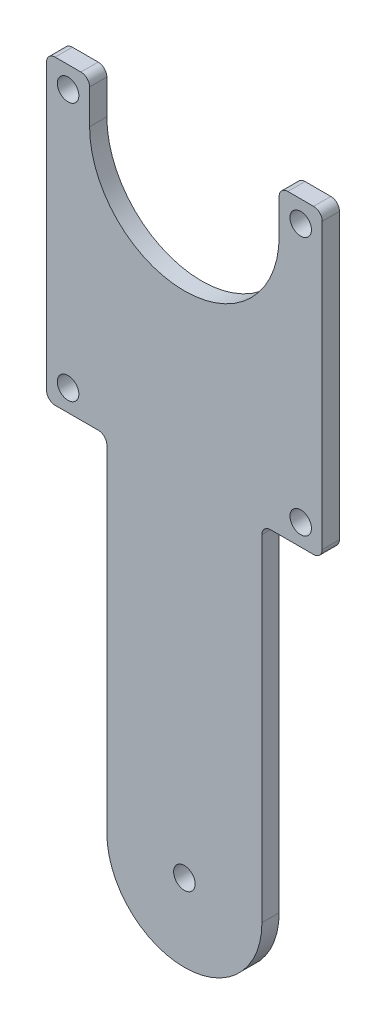
ISO-10303-21;
HEADER;
FILE_DESCRIPTION(('STEP AP214'),'2;1');
FILE_NAME('part.step','',(''),(''),'','','');
FILE_SCHEMA(('AUTOMOTIVE_DESIGN { 1 0 10303 214 1 1 1 1 }'));
ENDSEC;
DATA;
#1=APPLICATION_CONTEXT('core data for automotive mechanical design processes');
#2=APPLICATION_PROTOCOL_DEFINITION('international standard','automotive_design',2000,#1);
#3=PRODUCT_CONTEXT('',#1,'mechanical');
#4=PRODUCT('Part','Part','',(#3));
#5=PRODUCT_RELATED_PRODUCT_CATEGORY('part','',(#4));
#6=PRODUCT_DEFINITION_FORMATION('','',#4);
#7=PRODUCT_DEFINITION_CONTEXT('part definition',#1,'design');
#8=PRODUCT_DEFINITION('design','',#6,#7);
#9=PRODUCT_DEFINITION_SHAPE('','',#8);
#10=(LENGTH_UNIT() NAMED_UNIT(*) SI_UNIT(.MILLI.,.METRE.));
#11=(NAMED_UNIT(*) PLANE_ANGLE_UNIT() SI_UNIT($,.RADIAN.));
#12=(NAMED_UNIT(*) SI_UNIT($,.STERADIAN.) SOLID_ANGLE_UNIT());
#13=UNCERTAINTY_MEASURE_WITH_UNIT(LENGTH_MEASURE(1.E-05),#10,'distance_accuracy_value','');
#14=(GEOMETRIC_REPRESENTATION_CONTEXT(3) GLOBAL_UNCERTAINTY_ASSIGNED_CONTEXT((#13)) GLOBAL_UNIT_ASSIGNED_CONTEXT((#10,
#11,#12)) REPRESENTATION_CONTEXT('',''));
#15=CARTESIAN_POINT('',(0.,0.,0.));
#16=DIRECTION('',(0.,0.,1.));
#17=DIRECTION('',(1.,0.,0.));
#18=AXIS2_PLACEMENT_3D('',#15,#16,#17);
#19=CARTESIAN_POINT('',(0.,14.595813748091,2.));
#20=DIRECTION('',(0.,-1.,0.));
#21=DIRECTION('',(0.,0.,-1.));
#22=AXIS2_PLACEMENT_3D('',#19,#20,#21);
#23=PLANE('',#22);
#24=DIRECTION('',(-1.,0.,0.));
#25=VECTOR('',#24,1.);
#26=CARTESIAN_POINT('',(0.,14.595813748091,0.));
#27=LINE('',#26,#25);
#28=CARTESIAN_POINT('',(23.0486139328405,14.595813748091,0.));
#29=VERTEX_POINT('',#28);
#30=CARTESIAN_POINT('',(20.0486139328405,14.595813748091,0.));
#31=VERTEX_POINT('',#30);
#32=EDGE_CURVE('E218',#29,#31,#27,.T.);
#33=ORIENTED_EDGE('',*,*,#32,.T.);
#34=DIRECTION('',(0.,0.,-1.));
#35=VECTOR('',#34,1.);
#36=CARTESIAN_POINT('',(20.0486139328405,14.595813748091,2.));
#37=LINE('',#36,#35);
#38=CARTESIAN_POINT('',(20.0486139328405,14.595813748091,2.));
#39=VERTEX_POINT('',#38);
#40=EDGE_CURVE('E11',#39,#31,#37,.T.);
#41=ORIENTED_EDGE('',*,*,#40,.F.);
#42=DIRECTION('',(-1.,0.,0.));
#43=VECTOR('',#42,1.);
#44=CARTESIAN_POINT('',(0.,14.595813748091,2.));
#45=LINE('',#44,#43);
#46=CARTESIAN_POINT('',(23.0486139328405,14.595813748091,2.));
#47=VERTEX_POINT('',#46);
#48=EDGE_CURVE('E679',#47,#39,#45,.T.);
#49=ORIENTED_EDGE('',*,*,#48,.F.);
#50=DIRECTION('',(0.,0.,-1.));
#51=VECTOR('',#50,1.);
#52=CARTESIAN_POINT('',(23.0486139328405,14.595813748091,2.));
#53=LINE('',#52,#51);
#54=EDGE_CURVE('E51',#47,#29,#53,.T.);
#55=ORIENTED_EDGE('',*,*,#54,.T.);
#56=EDGE_LOOP('',(#33,#41,#49,#55));
#57=FACE_BOUND('',#56,.T.);
#58=ADVANCED_FACE('F34',(#57),#23,.F.);
#59=CARTESIAN_POINT('',(20.0486139328405,13.595813748091,2.));
#60=DIRECTION('',(0.,0.,-1.));
#61=DIRECTION('',(-1.,0.,0.));
#62=AXIS2_PLACEMENT_3D('',#59,#60,#61);
#63=CYLINDRICAL_SURFACE('',#62,1.);
#64=CARTESIAN_POINT('',(20.0486139328405,13.595813748091,0.));
#65=DIRECTION('',(0.,0.,1.));
#66=DIRECTION('',(1.,0.,0.));
#67=AXIS2_PLACEMENT_3D('',#64,#65,#66);
#68=CIRCLE('',#67,1.);
#69=CARTESIAN_POINT('',(19.0486139328405,13.595813748091,0.));
#70=VERTEX_POINT('',#69);
#71=EDGE_CURVE('E220',#31,#70,#68,.T.);
#72=ORIENTED_EDGE('',*,*,#71,.T.);
#73=DIRECTION('',(0.,0.,-1.));
#74=VECTOR('',#73,1.);
#75=CARTESIAN_POINT('',(19.0486139328405,13.595813748091,2.));
#76=LINE('',#75,#74);
#77=CARTESIAN_POINT('',(19.0486139328405,13.595813748091,2.));
#78=VERTEX_POINT('',#77);
#79=EDGE_CURVE('E43',#78,#70,#76,.T.);
#80=ORIENTED_EDGE('',*,*,#79,.F.);
#81=CARTESIAN_POINT('',(20.0486139328405,13.595813748091,2.));
#82=DIRECTION('',(0.,0.,1.));
#83=DIRECTION('',(1.,0.,0.));
#84=AXIS2_PLACEMENT_3D('',#81,#82,#83);
#85=CIRCLE('',#84,1.);
#86=EDGE_CURVE('E125',#39,#78,#85,.T.);
#87=ORIENTED_EDGE('',*,*,#86,.F.);
#88=ORIENTED_EDGE('',*,*,#40,.T.);
#89=EDGE_LOOP('',(#72,#80,#87,#88));
#90=FACE_BOUND('',#89,.T.);
#91=ADVANCED_FACE('F374',(#90),#63,.T.);
#92=CARTESIAN_POINT('',(19.0486139328405,0.,2.));
#93=DIRECTION('',(1.,0.,0.));
#94=DIRECTION('',(0.,0.,-1.));
#95=AXIS2_PLACEMENT_3D('',#92,#93,#94);
#96=PLANE('',#95);
#97=DIRECTION('',(0.,-1.,0.));
#98=VECTOR('',#97,1.);
#99=CARTESIAN_POINT('',(19.0486139328405,0.,0.));
#100=LINE('',#99,#98);
#101=CARTESIAN_POINT('',(19.0486139328405,9.59581374809096,0.));
#102=VERTEX_POINT('',#101);
#103=EDGE_CURVE('E222',#70,#102,#100,.T.);
#104=ORIENTED_EDGE('',*,*,#103,.T.);
#105=DIRECTION('',(0.,0.,-1.));
#106=VECTOR('',#105,1.);
#107=CARTESIAN_POINT('',(19.0486139328405,9.59581374809096,2.));
#108=LINE('',#107,#106);
#109=CARTESIAN_POINT('',(19.0486139328405,9.59581374809096,2.));
#110=VERTEX_POINT('',#109);
#111=EDGE_CURVE('E303',#110,#102,#108,.T.);
#112=ORIENTED_EDGE('',*,*,#111,.F.);
#113=DIRECTION('',(0.,-1.,0.));
#114=VECTOR('',#113,1.);
#115=CARTESIAN_POINT('',(19.0486139328405,0.,2.));
#116=LINE('',#115,#114);
#117=EDGE_CURVE('E310',#78,#110,#116,.T.);
#118=ORIENTED_EDGE('',*,*,#117,.F.);
#119=ORIENTED_EDGE('',*,*,#79,.T.);
#120=EDGE_LOOP('',(#104,#112,#118,#119));
#121=FACE_BOUND('',#120,.T.);
#122=ADVANCED_FACE('F308',(#121),#96,.F.);
#123=CARTESIAN_POINT('',(8.0486139328405,9.59581374809096,2.));
#124=DIRECTION('',(0.,0.,-1.));
#125=DIRECTION('',(-1.,0.,0.));
#126=AXIS2_PLACEMENT_3D('',#123,#124,#125);
#127=CYLINDRICAL_SURFACE('',#126,11.);
#128=CARTESIAN_POINT('',(8.0486139328405,9.59581374809096,0.));
#129=DIRECTION('',(0.,0.,1.));
#130=DIRECTION('',(1.,0.,0.));
#131=AXIS2_PLACEMENT_3D('',#128,#129,#130);
#132=CIRCLE('',#131,11.);
#133=CARTESIAN_POINT('',(-2.95138606715949,9.59581374809096,0.));
#134=VERTEX_POINT('',#133);
#135=EDGE_CURVE('E225',#134,#102,#132,.T.);
#136=ORIENTED_EDGE('',*,*,#135,.F.);
#137=DIRECTION('',(0.,0.,-1.));
#138=VECTOR('',#137,1.);
#139=CARTESIAN_POINT('',(-2.95138606715949,9.59581374809096,2.));
#140=LINE('',#139,#138);
#141=CARTESIAN_POINT('',(-2.95138606715949,9.59581374809096,2.));
#142=VERTEX_POINT('',#141);
#143=EDGE_CURVE('E301',#142,#134,#140,.T.);
#144=ORIENTED_EDGE('',*,*,#143,.F.);
#145=CARTESIAN_POINT('',(8.0486139328405,9.59581374809096,2.));
#146=DIRECTION('',(0.,0.,1.));
#147=DIRECTION('',(1.,0.,0.));
#148=AXIS2_PLACEMENT_3D('',#145,#146,#147);
#149=CIRCLE('',#148,11.);
#150=EDGE_CURVE('E319',#142,#110,#149,.T.);
#151=ORIENTED_EDGE('',*,*,#150,.T.);
#152=ORIENTED_EDGE('',*,*,#111,.T.);
#153=EDGE_LOOP('',(#136,#144,#151,#152));
#154=FACE_BOUND('',#153,.T.);
#155=ADVANCED_FACE('F316',(#154),#127,.F.);
#156=CARTESIAN_POINT('',(-2.95138606715949,0.,2.));
#157=DIRECTION('',(1.,0.,0.));
#158=DIRECTION('',(0.,0.,-1.));
#159=AXIS2_PLACEMENT_3D('',#156,#157,#158);
#160=PLANE('',#159);
#161=DIRECTION('',(0.,-1.,0.));
#162=VECTOR('',#161,1.);
#163=CARTESIAN_POINT('',(-2.95138606715949,0.,0.));
#164=LINE('',#163,#162);
#165=CARTESIAN_POINT('',(-2.95138606715949,13.595813748091,0.));
#166=VERTEX_POINT('',#165);
#167=EDGE_CURVE('E228',#166,#134,#164,.T.);
#168=ORIENTED_EDGE('',*,*,#167,.F.);
#169=DIRECTION('',(0.,0.,-1.));
#170=VECTOR('',#169,1.);
#171=CARTESIAN_POINT('',(-2.95138606715949,13.595813748091,2.));
#172=LINE('',#171,#170);
#173=CARTESIAN_POINT('',(-2.95138606715949,13.595813748091,2.));
#174=VERTEX_POINT('',#173);
#175=EDGE_CURVE('E299',#174,#166,#172,.T.);
#176=ORIENTED_EDGE('',*,*,#175,.F.);
#177=DIRECTION('',(0.,-1.,0.));
#178=VECTOR('',#177,1.);
#179=CARTESIAN_POINT('',(-2.95138606715949,0.,2.));
#180=LINE('',#179,#178);
#181=EDGE_CURVE('E322',#174,#142,#180,.T.);
#182=ORIENTED_EDGE('',*,*,#181,.T.);
#183=ORIENTED_EDGE('',*,*,#143,.T.);
#184=EDGE_LOOP('',(#168,#176,#182,#183));
#185=FACE_BOUND('',#184,.T.);
#186=ADVANCED_FACE('F591',(#185),#160,.T.);
#187=CARTESIAN_POINT('',(-3.95138606715949,13.595813748091,2.));
#188=DIRECTION('',(0.,0.,-1.));
#189=DIRECTION('',(-1.,0.,0.));
#190=AXIS2_PLACEMENT_3D('',#187,#188,#189);
#191=CYLINDRICAL_SURFACE('',#190,1.);
#192=CARTESIAN_POINT('',(-3.95138606715949,13.595813748091,0.));
#193=DIRECTION('',(0.,0.,1.));
#194=DIRECTION('',(1.,0.,0.));
#195=AXIS2_PLACEMENT_3D('',#192,#193,#194);
#196=CIRCLE('',#195,1.);
#197=CARTESIAN_POINT('',(-3.9513860671595,14.595813748091,0.));
#198=VERTEX_POINT('',#197);
#199=EDGE_CURVE('E231',#198,#166,#196,.F.);
#200=ORIENTED_EDGE('',*,*,#199,.F.);
#201=DIRECTION('',(0.,0.,-1.));
#202=VECTOR('',#201,1.);
#203=CARTESIAN_POINT('',(-3.9513860671595,14.595813748091,2.));
#204=LINE('',#203,#202);
#205=CARTESIAN_POINT('',(-3.9513860671595,14.595813748091,2.));
#206=VERTEX_POINT('',#205);
#207=EDGE_CURVE('E297',#206,#198,#204,.T.);
#208=ORIENTED_EDGE('',*,*,#207,.F.);
#209=CARTESIAN_POINT('',(-3.95138606715949,13.595813748091,2.));
#210=DIRECTION('',(0.,0.,1.));
#211=DIRECTION('',(1.,0.,0.));
#212=AXIS2_PLACEMENT_3D('',#209,#210,#211);
#213=CIRCLE('',#212,1.);
#214=EDGE_CURVE('E324',#206,#174,#213,.F.);
#215=ORIENTED_EDGE('',*,*,#214,.T.);
#216=ORIENTED_EDGE('',*,*,#175,.T.);
#217=EDGE_LOOP('',(#200,#208,#215,#216));
#218=FACE_BOUND('',#217,.T.);
#219=ADVANCED_FACE('F581',(#218),#191,.T.);
#220=CARTESIAN_POINT('',(0.,14.595813748091,2.));
#221=DIRECTION('',(0.,-1.,0.));
#222=DIRECTION('',(1.,0.,0.));
#223=AXIS2_PLACEMENT_3D('',#220,#221,#222);
#224=PLANE('',#223);
#225=DIRECTION('',(-1.,0.,0.));
#226=VECTOR('',#225,1.);
#227=CARTESIAN_POINT('',(0.,14.595813748091,0.));
#228=LINE('',#227,#226);
#229=CARTESIAN_POINT('',(-6.95138606715951,14.595813748091,0.));
#230=VERTEX_POINT('',#229);
#231=EDGE_CURVE('E234',#198,#230,#228,.T.);
#232=ORIENTED_EDGE('',*,*,#231,.T.);
#233=DIRECTION('',(0.,0.,-1.));
#234=VECTOR('',#233,1.);
#235=CARTESIAN_POINT('',(-6.95138606715951,14.595813748091,2.));
#236=LINE('',#235,#234);
#237=CARTESIAN_POINT('',(-6.95138606715951,14.595813748091,2.));
#238=VERTEX_POINT('',#237);
#239=EDGE_CURVE('E294',#238,#230,#236,.T.);
#240=ORIENTED_EDGE('',*,*,#239,.F.);
#241=DIRECTION('',(-1.,0.,0.));
#242=VECTOR('',#241,1.);
#243=CARTESIAN_POINT('',(0.,14.595813748091,2.));
#244=LINE('',#243,#242);
#245=EDGE_CURVE('E331',#206,#238,#244,.T.);
#246=ORIENTED_EDGE('',*,*,#245,.F.);
#247=ORIENTED_EDGE('',*,*,#207,.T.);
#248=EDGE_LOOP('',(#232,#240,#246,#247));
#249=FACE_BOUND('',#248,.T.);
#250=ADVANCED_FACE('F570',(#249),#224,.F.);
#251=CARTESIAN_POINT('',(-6.95138606715951,13.595813748091,2.));
#252=DIRECTION('',(0.,0.,-1.));
#253=DIRECTION('',(-1.,0.,0.));
#254=AXIS2_PLACEMENT_3D('',#251,#252,#253);
#255=CYLINDRICAL_SURFACE('',#254,1.);
#256=CARTESIAN_POINT('',(-6.95138606715951,13.595813748091,0.));
#257=DIRECTION('',(0.,0.,1.));
#258=DIRECTION('',(1.,0.,0.));
#259=AXIS2_PLACEMENT_3D('',#256,#257,#258);
#260=CIRCLE('',#259,1.);
#261=CARTESIAN_POINT('',(-7.95138606715951,13.595813748091,0.));
#262=VERTEX_POINT('',#261);
#263=EDGE_CURVE('E236',#230,#262,#260,.T.);
#264=ORIENTED_EDGE('',*,*,#263,.T.);
#265=DIRECTION('',(0.,0.,-1.));
#266=VECTOR('',#265,1.);
#267=CARTESIAN_POINT('',(-7.95138606715951,13.595813748091,2.));
#268=LINE('',#267,#266);
#269=CARTESIAN_POINT('',(-7.95138606715951,13.595813748091,2.));
#270=VERTEX_POINT('',#269);
#271=EDGE_CURVE('E291',#270,#262,#268,.T.);
#272=ORIENTED_EDGE('',*,*,#271,.F.);
#273=CARTESIAN_POINT('',(-6.95138606715951,13.595813748091,2.));
#274=DIRECTION('',(0.,0.,1.));
#275=DIRECTION('',(1.,0.,0.));
#276=AXIS2_PLACEMENT_3D('',#273,#274,#275);
#277=CIRCLE('',#276,1.);
#278=EDGE_CURVE('E333',#238,#270,#277,.T.);
#279=ORIENTED_EDGE('',*,*,#278,.F.);
#280=ORIENTED_EDGE('',*,*,#239,.T.);
#281=EDGE_LOOP('',(#264,#272,#279,#280));
#282=FACE_BOUND('',#281,.T.);
#283=ADVANCED_FACE('F559',(#282),#255,.T.);
#284=CARTESIAN_POINT('',(-7.95138606715951,0.,2.));
#285=DIRECTION('',(1.,0.,0.));
#286=DIRECTION('',(0.,0.,-1.));
#287=AXIS2_PLACEMENT_3D('',#284,#285,#286);
#288=PLANE('',#287);
#289=DIRECTION('',(0.,-1.,0.));
#290=VECTOR('',#289,1.);
#291=CARTESIAN_POINT('',(-7.95138606715951,0.,0.));
#292=LINE('',#291,#290);
#293=CARTESIAN_POINT('',(-7.95138606715951,-19.404186251909,0.));
#294=VERTEX_POINT('',#293);
#295=EDGE_CURVE('E238',#262,#294,#292,.T.);
#296=ORIENTED_EDGE('',*,*,#295,.T.);
#297=DIRECTION('',(0.,0.,-1.));
#298=VECTOR('',#297,1.);
#299=CARTESIAN_POINT('',(-7.95138606715951,-19.404186251909,2.));
#300=LINE('',#299,#298);
#301=CARTESIAN_POINT('',(-7.95138606715951,-19.404186251909,2.));
#302=VERTEX_POINT('',#301);
#303=EDGE_CURVE('E289',#302,#294,#300,.T.);
#304=ORIENTED_EDGE('',*,*,#303,.F.);
#305=DIRECTION('',(0.,-1.,0.));
#306=VECTOR('',#305,1.);
#307=CARTESIAN_POINT('',(-7.95138606715951,0.,2.));
#308=LINE('',#307,#306);
#309=EDGE_CURVE('E335',#270,#302,#308,.T.);
#310=ORIENTED_EDGE('',*,*,#309,.F.);
#311=ORIENTED_EDGE('',*,*,#271,.T.);
#312=EDGE_LOOP('',(#296,#304,#310,#311));
#313=FACE_BOUND('',#312,.T.);
#314=ADVANCED_FACE('F549',(#313),#288,.F.);
#315=CARTESIAN_POINT('',(-6.95138606715951,-19.404186251909,2.));
#316=DIRECTION('',(0.,0.,-1.));
#317=DIRECTION('',(-1.,0.,0.));
#318=AXIS2_PLACEMENT_3D('',#315,#316,#317);
#319=CYLINDRICAL_SURFACE('',#318,1.);
#320=CARTESIAN_POINT('',(-6.95138606715951,-19.404186251909,0.));
#321=DIRECTION('',(0.,0.,1.));
#322=DIRECTION('',(1.,0.,0.));
#323=AXIS2_PLACEMENT_3D('',#320,#321,#322);
#324=CIRCLE('',#323,1.);
#325=CARTESIAN_POINT('',(-6.9513860671595,-20.404186251909,0.));
#326=VERTEX_POINT('',#325);
#327=EDGE_CURVE('E241',#326,#294,#324,.F.);
#328=ORIENTED_EDGE('',*,*,#327,.F.);
#329=DIRECTION('',(0.,0.,-1.));
#330=VECTOR('',#329,1.);
#331=CARTESIAN_POINT('',(-6.9513860671595,-20.404186251909,2.));
#332=LINE('',#331,#330);
#333=CARTESIAN_POINT('',(-6.9513860671595,-20.404186251909,2.));
#334=VERTEX_POINT('',#333);
#335=EDGE_CURVE('E287',#334,#326,#332,.T.);
#336=ORIENTED_EDGE('',*,*,#335,.F.);
#337=CARTESIAN_POINT('',(-6.95138606715951,-19.404186251909,2.));
#338=DIRECTION('',(0.,0.,1.));
#339=DIRECTION('',(1.,0.,0.));
#340=AXIS2_PLACEMENT_3D('',#337,#338,#339);
#341=CIRCLE('',#340,1.);
#342=EDGE_CURVE('E337',#334,#302,#341,.F.);
#343=ORIENTED_EDGE('',*,*,#342,.T.);
#344=ORIENTED_EDGE('',*,*,#303,.T.);
#345=EDGE_LOOP('',(#328,#336,#343,#344));
#346=FACE_BOUND('',#345,.T.);
#347=ADVANCED_FACE('F539',(#346),#319,.T.);
#348=CARTESIAN_POINT('',(0.,-20.404186251909,2.));
#349=DIRECTION('',(0.,-1.,0.));
#350=DIRECTION('',(1.,0.,0.));
#351=AXIS2_PLACEMENT_3D('',#348,#349,#350);
#352=PLANE('',#351);
#353=DIRECTION('',(-1.,0.,0.));
#354=VECTOR('',#353,1.);
#355=CARTESIAN_POINT('',(0.,-20.404186251909,0.));
#356=LINE('',#355,#354);
#357=CARTESIAN_POINT('',(-1.95138606715951,-20.404186251909,0.));
#358=VERTEX_POINT('',#357);
#359=EDGE_CURVE('E244',#358,#326,#356,.T.);
#360=ORIENTED_EDGE('',*,*,#359,.F.);
#361=DIRECTION('',(0.,0.,-1.));
#362=VECTOR('',#361,1.);
#363=CARTESIAN_POINT('',(-1.95138606715951,-20.404186251909,2.));
#364=LINE('',#363,#362);
#365=CARTESIAN_POINT('',(-1.95138606715951,-20.404186251909,2.));
#366=VERTEX_POINT('',#365);
#367=EDGE_CURVE('E285',#366,#358,#364,.T.);
#368=ORIENTED_EDGE('',*,*,#367,.F.);
#369=DIRECTION('',(-1.,0.,0.));
#370=VECTOR('',#369,1.);
#371=CARTESIAN_POINT('',(0.,-20.404186251909,2.));
#372=LINE('',#371,#370);
#373=EDGE_CURVE('E340',#366,#334,#372,.T.);
#374=ORIENTED_EDGE('',*,*,#373,.T.);
#375=ORIENTED_EDGE('',*,*,#335,.T.);
#376=EDGE_LOOP('',(#360,#368,#374,#375));
#377=FACE_BOUND('',#376,.T.);
#378=ADVANCED_FACE('F529',(#377),#352,.T.);
#379=CARTESIAN_POINT('',(-1.9513860671595,-21.404186251909,2.));
#380=DIRECTION('',(0.,0.,-1.));
#381=DIRECTION('',(-1.,0.,0.));
#382=AXIS2_PLACEMENT_3D('',#379,#380,#381);
#383=CYLINDRICAL_SURFACE('',#382,1.);
#384=CARTESIAN_POINT('',(-1.9513860671595,-21.404186251909,0.));
#385=DIRECTION('',(0.,0.,1.));
#386=DIRECTION('',(1.,0.,0.));
#387=AXIS2_PLACEMENT_3D('',#384,#385,#386);
#388=CIRCLE('',#387,1.);
#389=CARTESIAN_POINT('',(-0.951386067159499,-21.404186251909,0.));
#390=VERTEX_POINT('',#389);
#391=EDGE_CURVE('E247',#390,#358,#388,.T.);
#392=ORIENTED_EDGE('',*,*,#391,.F.);
#393=DIRECTION('',(0.,0.,-1.));
#394=VECTOR('',#393,1.);
#395=CARTESIAN_POINT('',(-0.951386067159499,-21.404186251909,2.));
#396=LINE('',#395,#394);
#397=CARTESIAN_POINT('',(-0.951386067159499,-21.404186251909,2.));
#398=VERTEX_POINT('',#397);
#399=EDGE_CURVE('E283',#398,#390,#396,.T.);
#400=ORIENTED_EDGE('',*,*,#399,.F.);
#401=CARTESIAN_POINT('',(-1.9513860671595,-21.404186251909,2.));
#402=DIRECTION('',(0.,0.,1.));
#403=DIRECTION('',(1.,0.,0.));
#404=AXIS2_PLACEMENT_3D('',#401,#402,#403);
#405=CIRCLE('',#404,1.);
#406=EDGE_CURVE('E343',#398,#366,#405,.T.);
#407=ORIENTED_EDGE('',*,*,#406,.T.);
#408=ORIENTED_EDGE('',*,*,#367,.T.);
#409=EDGE_LOOP('',(#392,#400,#407,#408));
#410=FACE_BOUND('',#409,.T.);
#411=ADVANCED_FACE('F519',(#410),#383,.F.);
#412=CARTESIAN_POINT('',(-0.9513860671595,0.,2.));
#413=DIRECTION('',(-1.,0.,0.));
#414=DIRECTION('',(0.,-1.,0.));
#415=AXIS2_PLACEMENT_3D('',#412,#413,#414);
#416=PLANE('',#415);
#417=DIRECTION('',(0.,1.,0.));
#418=VECTOR('',#417,1.);
#419=CARTESIAN_POINT('',(-0.9513860671595,0.,0.));
#420=LINE('',#419,#418);
#421=CARTESIAN_POINT('',(-0.951386067159495,-60.404186251909,0.));
#422=VERTEX_POINT('',#421);
#423=EDGE_CURVE('E250',#422,#390,#420,.T.);
#424=ORIENTED_EDGE('',*,*,#423,.F.);
#425=DIRECTION('',(0.,0.,-1.));
#426=VECTOR('',#425,1.);
#427=CARTESIAN_POINT('',(-0.951386067159495,-60.404186251909,2.));
#428=LINE('',#427,#426);
#429=CARTESIAN_POINT('',(-0.951386067159495,-60.404186251909,2.));
#430=VERTEX_POINT('',#429);
#431=EDGE_CURVE('E281',#430,#422,#428,.T.);
#432=ORIENTED_EDGE('',*,*,#431,.F.);
#433=DIRECTION('',(0.,1.,0.));
#434=VECTOR('',#433,1.);
#435=CARTESIAN_POINT('',(-0.9513860671595,0.,2.));
#436=LINE('',#435,#434);
#437=EDGE_CURVE('E346',#430,#398,#436,.T.);
#438=ORIENTED_EDGE('',*,*,#437,.T.);
#439=ORIENTED_EDGE('',*,*,#399,.T.);
#440=EDGE_LOOP('',(#424,#432,#438,#439));
#441=FACE_BOUND('',#440,.T.);
#442=ADVANCED_FACE('F509',(#441),#416,.T.);
#443=CARTESIAN_POINT('',(8.0486139328405,-60.404186251909,2.));
#444=DIRECTION('',(0.,0.,-1.));
#445=DIRECTION('',(-1.,0.,0.));
#446=AXIS2_PLACEMENT_3D('',#443,#444,#445);
#447=CYLINDRICAL_SURFACE('',#446,9.);
#448=CARTESIAN_POINT('',(8.0486139328405,-60.404186251909,0.));
#449=DIRECTION('',(0.,0.,1.));
#450=DIRECTION('',(1.,0.,0.));
#451=AXIS2_PLACEMENT_3D('',#448,#449,#450);
#452=CIRCLE('',#451,9.);
#453=CARTESIAN_POINT('',(17.0486139328405,-60.404186251909,0.));
#454=VERTEX_POINT('',#453);
#455=EDGE_CURVE('E253',#454,#422,#452,.F.);
#456=ORIENTED_EDGE('',*,*,#455,.F.);
#457=DIRECTION('',(0.,0.,-1.));
#458=VECTOR('',#457,1.);
#459=CARTESIAN_POINT('',(17.0486139328405,-60.404186251909,2.));
#460=LINE('',#459,#458);
#461=CARTESIAN_POINT('',(17.0486139328405,-60.404186251909,2.));
#462=VERTEX_POINT('',#461);
#463=EDGE_CURVE('E279',#462,#454,#460,.T.);
#464=ORIENTED_EDGE('',*,*,#463,.F.);
#465=CARTESIAN_POINT('',(8.0486139328405,-60.404186251909,2.));
#466=DIRECTION('',(0.,0.,1.));
#467=DIRECTION('',(1.,0.,0.));
#468=AXIS2_PLACEMENT_3D('',#465,#466,#467);
#469=CIRCLE('',#468,9.);
#470=EDGE_CURVE('E349',#462,#430,#469,.F.);
#471=ORIENTED_EDGE('',*,*,#470,.T.);
#472=ORIENTED_EDGE('',*,*,#431,.T.);
#473=EDGE_LOOP('',(#456,#464,#471,#472));
#474=FACE_BOUND('',#473,.T.);
#475=ADVANCED_FACE('F499',(#474),#447,.T.);
#476=CARTESIAN_POINT('',(17.0486139328405,0.,2.));
#477=DIRECTION('',(-1.,0.,0.));
#478=DIRECTION('',(0.,0.,1.));
#479=AXIS2_PLACEMENT_3D('',#476,#477,#478);
#480=PLANE('',#479);
#481=DIRECTION('',(0.,1.,0.));
#482=VECTOR('',#481,1.);
#483=CARTESIAN_POINT('',(17.0486139328405,0.,0.));
#484=LINE('',#483,#482);
#485=CARTESIAN_POINT('',(17.0486139328405,-21.404186251909,0.));
#486=VERTEX_POINT('',#485);
#487=EDGE_CURVE('E256',#454,#486,#484,.T.);
#488=ORIENTED_EDGE('',*,*,#487,.T.);
#489=DIRECTION('',(0.,0.,-1.));
#490=VECTOR('',#489,1.);
#491=CARTESIAN_POINT('',(17.0486139328405,-21.404186251909,2.));
#492=LINE('',#491,#490);
#493=CARTESIAN_POINT('',(17.0486139328405,-21.404186251909,2.));
#494=VERTEX_POINT('',#493);
#495=EDGE_CURVE('E276',#494,#486,#492,.T.);
#496=ORIENTED_EDGE('',*,*,#495,.F.);
#497=DIRECTION('',(0.,1.,0.));
#498=VECTOR('',#497,1.);
#499=CARTESIAN_POINT('',(17.0486139328405,0.,2.));
#500=LINE('',#499,#498);
#501=EDGE_CURVE('E352',#462,#494,#500,.T.);
#502=ORIENTED_EDGE('',*,*,#501,.F.);
#503=ORIENTED_EDGE('',*,*,#463,.T.);
#504=EDGE_LOOP('',(#488,#496,#502,#503));
#505=FACE_BOUND('',#504,.T.);
#506=ADVANCED_FACE('F489',(#505),#480,.F.);
#507=CARTESIAN_POINT('',(18.0486139328405,-21.404186251909,2.));
#508=DIRECTION('',(0.,0.,-1.));
#509=DIRECTION('',(-1.,0.,0.));
#510=AXIS2_PLACEMENT_3D('',#507,#508,#509);
#511=CYLINDRICAL_SURFACE('',#510,1.);
#512=CARTESIAN_POINT('',(18.0486139328405,-21.404186251909,0.));
#513=DIRECTION('',(0.,0.,1.));
#514=DIRECTION('',(1.,0.,0.));
#515=AXIS2_PLACEMENT_3D('',#512,#513,#514);
#516=CIRCLE('',#515,1.);
#517=CARTESIAN_POINT('',(18.0486139328405,-20.404186251909,0.));
#518=VERTEX_POINT('',#517);
#519=EDGE_CURVE('E258',#486,#518,#516,.F.);
#520=ORIENTED_EDGE('',*,*,#519,.T.);
#521=DIRECTION('',(0.,0.,-1.));
#522=VECTOR('',#521,1.);
#523=CARTESIAN_POINT('',(18.0486139328405,-20.404186251909,2.));
#524=LINE('',#523,#522);
#525=CARTESIAN_POINT('',(18.0486139328405,-20.404186251909,2.));
#526=VERTEX_POINT('',#525);
#527=EDGE_CURVE('E274',#526,#518,#524,.T.);
#528=ORIENTED_EDGE('',*,*,#527,.F.);
#529=CARTESIAN_POINT('',(18.0486139328405,-21.404186251909,2.));
#530=DIRECTION('',(0.,0.,1.));
#531=DIRECTION('',(1.,0.,0.));
#532=AXIS2_PLACEMENT_3D('',#529,#530,#531);
#533=CIRCLE('',#532,1.);
#534=EDGE_CURVE('E354',#494,#526,#533,.F.);
#535=ORIENTED_EDGE('',*,*,#534,.F.);
#536=ORIENTED_EDGE('',*,*,#495,.T.);
#537=EDGE_LOOP('',(#520,#528,#535,#536));
#538=FACE_BOUND('',#537,.T.);
#539=ADVANCED_FACE('F480',(#538),#511,.F.);
#540=CARTESIAN_POINT('',(0.,-20.404186251909,2.));
#541=DIRECTION('',(0.,-1.,0.));
#542=DIRECTION('',(0.,0.,-1.));
#543=AXIS2_PLACEMENT_3D('',#540,#541,#542);
#544=PLANE('',#543);
#545=DIRECTION('',(-1.,0.,0.));
#546=VECTOR('',#545,1.);
#547=CARTESIAN_POINT('',(0.,-20.404186251909,0.));
#548=LINE('',#547,#546);
#549=CARTESIAN_POINT('',(23.0486139328405,-20.404186251909,0.));
#550=VERTEX_POINT('',#549);
#551=EDGE_CURVE('E261',#550,#518,#548,.T.);
#552=ORIENTED_EDGE('',*,*,#551,.F.);
#553=DIRECTION('',(0.,0.,-1.));
#554=VECTOR('',#553,1.);
#555=CARTESIAN_POINT('',(23.0486139328405,-20.404186251909,2.));
#556=LINE('',#555,#554);
#557=CARTESIAN_POINT('',(23.0486139328405,-20.404186251909,2.));
#558=VERTEX_POINT('',#557);
#559=EDGE_CURVE('E195',#558,#550,#556,.T.);
#560=ORIENTED_EDGE('',*,*,#559,.F.);
#561=DIRECTION('',(-1.,0.,0.));
#562=VECTOR('',#561,1.);
#563=CARTESIAN_POINT('',(0.,-20.404186251909,2.));
#564=LINE('',#563,#562);
#565=EDGE_CURVE('E185',#558,#526,#564,.T.);
#566=ORIENTED_EDGE('',*,*,#565,.T.);
#567=ORIENTED_EDGE('',*,*,#527,.T.);
#568=EDGE_LOOP('',(#552,#560,#566,#567));
#569=FACE_BOUND('',#568,.T.);
#570=ADVANCED_FACE('F357',(#569),#544,.T.);
#571=CARTESIAN_POINT('',(23.0486139328405,-19.404186251909,2.));
#572=DIRECTION('',(0.,0.,-1.));
#573=DIRECTION('',(-1.,0.,0.));
#574=AXIS2_PLACEMENT_3D('',#571,#572,#573);
#575=CYLINDRICAL_SURFACE('',#574,1.);
#576=CARTESIAN_POINT('',(23.0486139328405,-19.404186251909,0.));
#577=DIRECTION('',(0.,0.,1.));
#578=DIRECTION('',(1.,0.,0.));
#579=AXIS2_PLACEMENT_3D('',#576,#577,#578);
#580=CIRCLE('',#579,1.);
#581=CARTESIAN_POINT('',(24.0486139328405,-19.404186251909,0.));
#582=VERTEX_POINT('',#581);
#583=EDGE_CURVE('E192',#550,#582,#580,.T.);
#584=ORIENTED_EDGE('',*,*,#583,.T.);
#585=DIRECTION('',(0.,0.,-1.));
#586=VECTOR('',#585,1.);
#587=CARTESIAN_POINT('',(24.0486139328405,-19.404186251909,2.));
#588=LINE('',#587,#586);
#589=CARTESIAN_POINT('',(24.0486139328405,-19.404186251909,2.));
#590=VERTEX_POINT('',#589);
#591=EDGE_CURVE('E189',#590,#582,#588,.T.);
#592=ORIENTED_EDGE('',*,*,#591,.F.);
#593=CARTESIAN_POINT('',(23.0486139328405,-19.404186251909,2.));
#594=DIRECTION('',(0.,0.,1.));
#595=DIRECTION('',(1.,0.,0.));
#596=AXIS2_PLACEMENT_3D('',#593,#594,#595);
#597=CIRCLE('',#596,1.);
#598=EDGE_CURVE('E178',#558,#590,#597,.T.);
#599=ORIENTED_EDGE('',*,*,#598,.F.);
#600=ORIENTED_EDGE('',*,*,#559,.T.);
#601=EDGE_LOOP('',(#584,#592,#599,#600));
#602=FACE_BOUND('',#601,.T.);
#603=ADVANCED_FACE('F190',(#602),#575,.T.);
#604=CARTESIAN_POINT('',(24.0486139328405,0.,2.));
#605=DIRECTION('',(1.,0.,0.));
#606=DIRECTION('',(0.,1.,0.));
#607=AXIS2_PLACEMENT_3D('',#604,#605,#606);
#608=PLANE('',#607);
#609=DIRECTION('',(0.,-1.,0.));
#610=VECTOR('',#609,1.);
#611=CARTESIAN_POINT('',(24.0486139328405,0.,0.));
#612=LINE('',#611,#610);
#613=CARTESIAN_POINT('',(24.0486139328405,13.595813748091,0.));
#614=VERTEX_POINT('',#613);
#615=EDGE_CURVE('E265',#614,#582,#612,.T.);
#616=ORIENTED_EDGE('',*,*,#615,.F.);
#617=DIRECTION('',(0.,0.,-1.));
#618=VECTOR('',#617,1.);
#619=CARTESIAN_POINT('',(24.0486139328405,13.595813748091,2.));
#620=LINE('',#619,#618);
#621=CARTESIAN_POINT('',(24.0486139328405,13.595813748091,2.));
#622=VERTEX_POINT('',#621);
#623=EDGE_CURVE('E113',#622,#614,#620,.T.);
#624=ORIENTED_EDGE('',*,*,#623,.F.);
#625=DIRECTION('',(0.,-1.,0.));
#626=VECTOR('',#625,1.);
#627=CARTESIAN_POINT('',(24.0486139328405,0.,2.));
#628=LINE('',#627,#626);
#629=EDGE_CURVE('E183',#622,#590,#628,.T.);
#630=ORIENTED_EDGE('',*,*,#629,.T.);
#631=ORIENTED_EDGE('',*,*,#591,.T.);
#632=EDGE_LOOP('',(#616,#624,#630,#631));
#633=FACE_BOUND('',#632,.T.);
#634=ADVANCED_FACE('F197',(#633),#608,.T.);
#635=CARTESIAN_POINT('',(8.0486139328405,-60.404186251909,2.));
#636=DIRECTION('',(0.,0.,-1.));
#637=DIRECTION('',(-1.,0.,0.));
#638=AXIS2_PLACEMENT_3D('',#635,#636,#637);
#639=CYLINDRICAL_SURFACE('',#638,1.25);
#640=CARTESIAN_POINT('',(8.0486139328405,-60.404186251909,2.));
#641=DIRECTION('',(0.,0.,1.));
#642=DIRECTION('',(1.,0.,0.));
#643=AXIS2_PLACEMENT_3D('',#640,#641,#642);
#644=CIRCLE('',#643,1.25);
#645=CARTESIAN_POINT('',(9.2986139328405,-60.404186251909,2.));
#646=VERTEX_POINT('',#645);
#647=EDGE_CURVE('E676',#646,#646,#644,.T.);
#648=ORIENTED_EDGE('',*,*,#647,.T.);
#649=EDGE_LOOP('',(#648));
#650=FACE_BOUND('',#649,.T.);
#651=CARTESIAN_POINT('',(8.0486139328405,-60.404186251909,0.));
#652=DIRECTION('',(0.,0.,1.));
#653=DIRECTION('',(1.,0.,0.));
#654=AXIS2_PLACEMENT_3D('',#651,#652,#653);
#655=CIRCLE('',#654,1.25);
#656=CARTESIAN_POINT('',(9.2986139328405,-60.404186251909,0.));
#657=VERTEX_POINT('',#656);
#658=EDGE_CURVE('E215',#657,#657,#655,.T.);
#659=ORIENTED_EDGE('',*,*,#658,.F.);
#660=EDGE_LOOP('',(#659));
#661=FACE_BOUND('',#660,.T.);
#662=ADVANCED_FACE('F382',(#650,#661),#639,.F.);
#663=CARTESIAN_POINT('',(21.5486139328405,12.095813748091,2.));
#664=DIRECTION('',(0.,0.,-1.));
#665=DIRECTION('',(-1.,0.,0.));
#666=AXIS2_PLACEMENT_3D('',#663,#664,#665);
#667=CYLINDRICAL_SURFACE('',#666,1.25);
#668=CARTESIAN_POINT('',(21.5486139328405,12.095813748091,2.));
#669=DIRECTION('',(0.,0.,1.));
#670=DIRECTION('',(1.,0.,0.));
#671=AXIS2_PLACEMENT_3D('',#668,#669,#670);
#672=CIRCLE('',#671,1.25);
#673=CARTESIAN_POINT('',(22.7986139328405,12.095813748091,2.));
#674=VERTEX_POINT('',#673);
#675=EDGE_CURVE('E669',#674,#674,#672,.T.);
#676=ORIENTED_EDGE('',*,*,#675,.T.);
#677=EDGE_LOOP('',(#676));
#678=FACE_BOUND('',#677,.T.);
#679=CARTESIAN_POINT('',(21.5486139328405,12.095813748091,0.));
#680=DIRECTION('',(0.,0.,1.));
#681=DIRECTION('',(1.,0.,0.));
#682=AXIS2_PLACEMENT_3D('',#679,#680,#681);
#683=CIRCLE('',#682,1.25);
#684=CARTESIAN_POINT('',(22.7986139328405,12.095813748091,0.));
#685=VERTEX_POINT('',#684);
#686=EDGE_CURVE('E212',#685,#685,#683,.T.);
#687=ORIENTED_EDGE('',*,*,#686,.F.);
#688=EDGE_LOOP('',(#687));
#689=FACE_BOUND('',#688,.T.);
#690=ADVANCED_FACE('F385',(#678,#689),#667,.F.);
#691=CARTESIAN_POINT('',(-5.4513860671595,12.095813748091,2.));
#692=DIRECTION('',(0.,0.,-1.));
#693=DIRECTION('',(-1.,0.,0.));
#694=AXIS2_PLACEMENT_3D('',#691,#692,#693);
#695=CYLINDRICAL_SURFACE('',#694,1.25);
#696=CARTESIAN_POINT('',(-5.4513860671595,12.095813748091,2.));
#697=DIRECTION('',(0.,0.,1.));
#698=DIRECTION('',(1.,0.,0.));
#699=AXIS2_PLACEMENT_3D('',#696,#697,#698);
#700=CIRCLE('',#699,1.25);
#701=CARTESIAN_POINT('',(-4.2013860671595,12.095813748091,2.));
#702=VERTEX_POINT('',#701);
#703=EDGE_CURVE('E666',#702,#702,#700,.T.);
#704=ORIENTED_EDGE('',*,*,#703,.T.);
#705=EDGE_LOOP('',(#704));
#706=FACE_BOUND('',#705,.T.);
#707=CARTESIAN_POINT('',(-5.4513860671595,12.095813748091,0.));
#708=DIRECTION('',(0.,0.,1.));
#709=DIRECTION('',(1.,0.,0.));
#710=AXIS2_PLACEMENT_3D('',#707,#708,#709);
#711=CIRCLE('',#710,1.25);
#712=CARTESIAN_POINT('',(-4.2013860671595,12.095813748091,0.));
#713=VERTEX_POINT('',#712);
#714=EDGE_CURVE('E209',#713,#713,#711,.T.);
#715=ORIENTED_EDGE('',*,*,#714,.F.);
#716=EDGE_LOOP('',(#715));
#717=FACE_BOUND('',#716,.T.);
#718=ADVANCED_FACE('F389',(#706,#717),#695,.F.);
#719=CARTESIAN_POINT('',(21.5486139328405,-17.904186251909,2.));
#720=DIRECTION('',(0.,0.,-1.));
#721=DIRECTION('',(-1.,0.,0.));
#722=AXIS2_PLACEMENT_3D('',#719,#720,#721);
#723=CYLINDRICAL_SURFACE('',#722,1.25);
#724=CARTESIAN_POINT('',(21.5486139328405,-17.904186251909,2.));
#725=DIRECTION('',(0.,0.,1.));
#726=DIRECTION('',(1.,0.,0.));
#727=AXIS2_PLACEMENT_3D('',#724,#725,#726);
#728=CIRCLE('',#727,1.25);
#729=CARTESIAN_POINT('',(22.7986139328405,-17.904186251909,2.));
#730=VERTEX_POINT('',#729);
#731=EDGE_CURVE('E400',#730,#730,#728,.T.);
#732=ORIENTED_EDGE('',*,*,#731,.T.);
#733=EDGE_LOOP('',(#732));
#734=FACE_BOUND('',#733,.T.);
#735=CARTESIAN_POINT('',(21.5486139328405,-17.904186251909,0.));
#736=DIRECTION('',(0.,0.,1.));
#737=DIRECTION('',(1.,0.,0.));
#738=AXIS2_PLACEMENT_3D('',#735,#736,#737);
#739=CIRCLE('',#738,1.25);
#740=CARTESIAN_POINT('',(22.7986139328405,-17.904186251909,0.));
#741=VERTEX_POINT('',#740);
#742=EDGE_CURVE('E206',#741,#741,#739,.T.);
#743=ORIENTED_EDGE('',*,*,#742,.F.);
#744=EDGE_LOOP('',(#743));
#745=FACE_BOUND('',#744,.T.);
#746=ADVANCED_FACE('F369',(#734,#745),#723,.F.);
#747=CARTESIAN_POINT('',(-5.4513860671595,-17.904186251909,2.));
#748=DIRECTION('',(0.,0.,-1.));
#749=DIRECTION('',(-1.,0.,0.));
#750=AXIS2_PLACEMENT_3D('',#747,#748,#749);
#751=CYLINDRICAL_SURFACE('',#750,1.25);
#752=CARTESIAN_POINT('',(-5.4513860671595,-17.904186251909,2.));
#753=DIRECTION('',(0.,0.,1.));
#754=DIRECTION('',(1.,0.,0.));
#755=AXIS2_PLACEMENT_3D('',#752,#753,#754);
#756=CIRCLE('',#755,1.25);
#757=CARTESIAN_POINT('',(-4.2013860671595,-17.904186251909,2.));
#758=VERTEX_POINT('',#757);
#759=EDGE_CURVE('E270',#758,#758,#756,.T.);
#760=ORIENTED_EDGE('',*,*,#759,.T.);
#761=EDGE_LOOP('',(#760));
#762=FACE_BOUND('',#761,.T.);
#763=CARTESIAN_POINT('',(-5.4513860671595,-17.904186251909,0.));
#764=DIRECTION('',(0.,0.,1.));
#765=DIRECTION('',(1.,0.,0.));
#766=AXIS2_PLACEMENT_3D('',#763,#764,#765);
#767=CIRCLE('',#766,1.25);
#768=CARTESIAN_POINT('',(-4.2013860671595,-17.904186251909,0.));
#769=VERTEX_POINT('',#768);
#770=EDGE_CURVE('E203',#769,#769,#767,.T.);
#771=ORIENTED_EDGE('',*,*,#770,.F.);
#772=EDGE_LOOP('',(#771));
#773=FACE_BOUND('',#772,.T.);
#774=ADVANCED_FACE('F36',(#762,#773),#751,.F.);
#775=CARTESIAN_POINT('',(23.0486139328405,13.595813748091,2.));
#776=DIRECTION('',(0.,0.,-1.));
#777=DIRECTION('',(-1.,0.,0.));
#778=AXIS2_PLACEMENT_3D('',#775,#776,#777);
#779=CYLINDRICAL_SURFACE('',#778,1.);
#780=CARTESIAN_POINT('',(23.0486139328405,13.595813748091,0.));
#781=DIRECTION('',(0.,0.,1.));
#782=DIRECTION('',(1.,0.,0.));
#783=AXIS2_PLACEMENT_3D('',#780,#781,#782);
#784=CIRCLE('',#783,1.);
#785=EDGE_CURVE('E267',#29,#614,#784,.F.);
#786=ORIENTED_EDGE('',*,*,#785,.F.);
#787=ORIENTED_EDGE('',*,*,#54,.F.);
#788=CARTESIAN_POINT('',(23.0486139328405,13.595813748091,2.));
#789=DIRECTION('',(0.,0.,1.));
#790=DIRECTION('',(1.,0.,0.));
#791=AXIS2_PLACEMENT_3D('',#788,#789,#790);
#792=CIRCLE('',#791,1.);
#793=EDGE_CURVE('E198',#47,#622,#792,.F.);
#794=ORIENTED_EDGE('',*,*,#793,.T.);
#795=ORIENTED_EDGE('',*,*,#623,.T.);
#796=EDGE_LOOP('',(#786,#787,#794,#795));
#797=FACE_BOUND('',#796,.T.);
#798=ADVANCED_FACE('F360',(#797),#779,.T.);
#799=CARTESIAN_POINT('',(0.,0.,2.));
#800=DIRECTION('',(0.,0.,1.));
#801=DIRECTION('',(1.,0.,0.));
#802=AXIS2_PLACEMENT_3D('',#799,#800,#801);
#803=PLANE('',#802);
#804=ORIENTED_EDGE('',*,*,#759,.F.);
#805=EDGE_LOOP('',(#804));
#806=FACE_BOUND('',#805,.T.);
#807=ORIENTED_EDGE('',*,*,#731,.F.);
#808=EDGE_LOOP('',(#807));
#809=FACE_BOUND('',#808,.T.);
#810=ORIENTED_EDGE('',*,*,#703,.F.);
#811=EDGE_LOOP('',(#810));
#812=FACE_BOUND('',#811,.T.);
#813=ORIENTED_EDGE('',*,*,#675,.F.);
#814=EDGE_LOOP('',(#813));
#815=FACE_BOUND('',#814,.T.);
#816=ORIENTED_EDGE('',*,*,#647,.F.);
#817=EDGE_LOOP('',(#816));
#818=FACE_BOUND('',#817,.T.);
#819=ORIENTED_EDGE('',*,*,#48,.T.);
#820=ORIENTED_EDGE('',*,*,#86,.T.);
#821=ORIENTED_EDGE('',*,*,#117,.T.);
#822=ORIENTED_EDGE('',*,*,#150,.F.);
#823=ORIENTED_EDGE('',*,*,#181,.F.);
#824=ORIENTED_EDGE('',*,*,#214,.F.);
#825=ORIENTED_EDGE('',*,*,#245,.T.);
#826=ORIENTED_EDGE('',*,*,#278,.T.);
#827=ORIENTED_EDGE('',*,*,#309,.T.);
#828=ORIENTED_EDGE('',*,*,#342,.F.);
#829=ORIENTED_EDGE('',*,*,#373,.F.);
#830=ORIENTED_EDGE('',*,*,#406,.F.);
#831=ORIENTED_EDGE('',*,*,#437,.F.);
#832=ORIENTED_EDGE('',*,*,#470,.F.);
#833=ORIENTED_EDGE('',*,*,#501,.T.);
#834=ORIENTED_EDGE('',*,*,#534,.T.);
#835=ORIENTED_EDGE('',*,*,#565,.F.);
#836=ORIENTED_EDGE('',*,*,#598,.T.);
#837=ORIENTED_EDGE('',*,*,#629,.F.);
#838=ORIENTED_EDGE('',*,*,#793,.F.);
#839=EDGE_LOOP('',(#819,#820,#821,#822,#823,#824,#825,#826,#827,#828,#829,#830,#831,#832,#833,
#834,#835,#836,#837,#838));
#840=FACE_BOUND('',#839,.T.);
#841=ADVANCED_FACE('F180',(#806,#809,#812,#815,#818,#840),#803,.T.);
#842=CARTESIAN_POINT('',(0.,0.,0.));
#843=DIRECTION('',(0.,0.,1.));
#844=DIRECTION('',(1.,0.,0.));
#845=AXIS2_PLACEMENT_3D('',#842,#843,#844);
#846=PLANE('',#845);
#847=ORIENTED_EDGE('',*,*,#770,.T.);
#848=EDGE_LOOP('',(#847));
#849=FACE_BOUND('',#848,.T.);
#850=ORIENTED_EDGE('',*,*,#742,.T.);
#851=EDGE_LOOP('',(#850));
#852=FACE_BOUND('',#851,.T.);
#853=ORIENTED_EDGE('',*,*,#714,.T.);
#854=EDGE_LOOP('',(#853));
#855=FACE_BOUND('',#854,.T.);
#856=ORIENTED_EDGE('',*,*,#686,.T.);
#857=EDGE_LOOP('',(#856));
#858=FACE_BOUND('',#857,.T.);
#859=ORIENTED_EDGE('',*,*,#658,.T.);
#860=EDGE_LOOP('',(#859));
#861=FACE_BOUND('',#860,.T.);
#862=ORIENTED_EDGE('',*,*,#32,.F.);
#863=ORIENTED_EDGE('',*,*,#785,.T.);
#864=ORIENTED_EDGE('',*,*,#615,.T.);
#865=ORIENTED_EDGE('',*,*,#583,.F.);
#866=ORIENTED_EDGE('',*,*,#551,.T.);
#867=ORIENTED_EDGE('',*,*,#519,.F.);
#868=ORIENTED_EDGE('',*,*,#487,.F.);
#869=ORIENTED_EDGE('',*,*,#455,.T.);
#870=ORIENTED_EDGE('',*,*,#423,.T.);
#871=ORIENTED_EDGE('',*,*,#391,.T.);
#872=ORIENTED_EDGE('',*,*,#359,.T.);
#873=ORIENTED_EDGE('',*,*,#327,.T.);
#874=ORIENTED_EDGE('',*,*,#295,.F.);
#875=ORIENTED_EDGE('',*,*,#263,.F.);
#876=ORIENTED_EDGE('',*,*,#231,.F.);
#877=ORIENTED_EDGE('',*,*,#199,.T.);
#878=ORIENTED_EDGE('',*,*,#167,.T.);
#879=ORIENTED_EDGE('',*,*,#135,.T.);
#880=ORIENTED_EDGE('',*,*,#103,.F.);
#881=ORIENTED_EDGE('',*,*,#71,.F.);
#882=EDGE_LOOP('',(#862,#863,#864,#865,#866,#867,#868,#869,#870,#871,#872,#873,#874,#875,#876,
#877,#878,#879,#880,#881));
#883=FACE_BOUND('',#882,.T.);
#884=ADVANCED_FACE('F312',(#849,#852,#855,#858,#861,#883),#846,.F.);
#885=CLOSED_SHELL('',(#58,#91,#122,#155,#186,#219,#250,#283,#314,#347,#378,#411,#442,#475,#506,
#539,#570,#603,#634,#662,#690,#718,#746,#774,#798,#841,#884));
#886=MANIFOLD_SOLID_BREP('B2',#885);
#887=ADVANCED_BREP_SHAPE_REPRESENTATION('',(#18,#886),#14);
#888=SHAPE_DEFINITION_REPRESENTATION(#9,#887);
ENDSEC;
END-ISO-10303-21;
